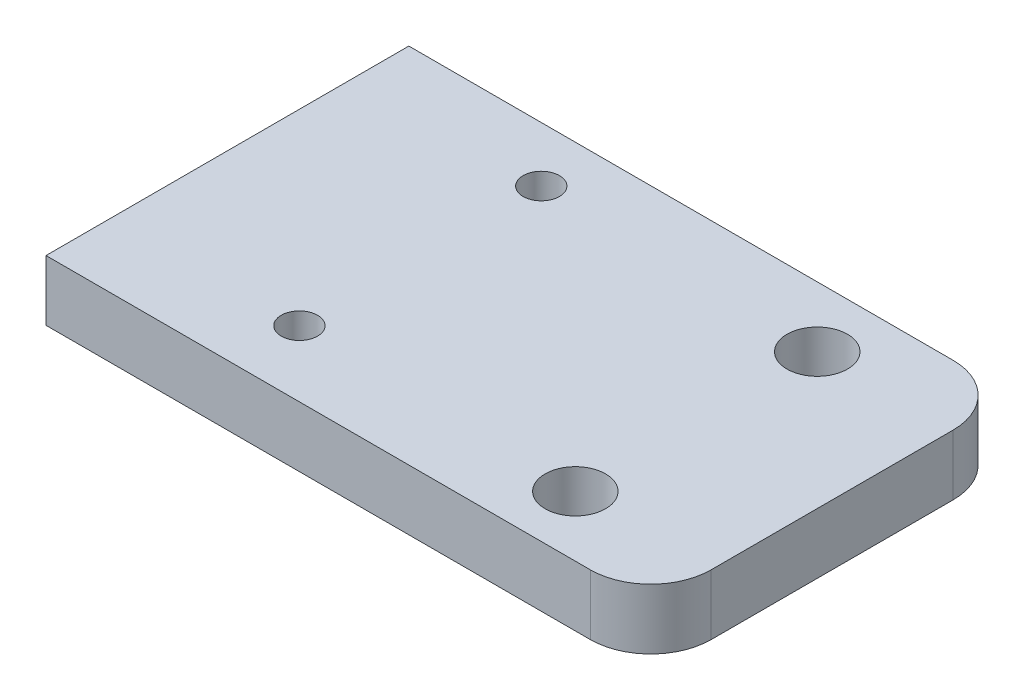
ISO-10303-21;
HEADER;
FILE_DESCRIPTION(('STEP AP214'),'2;1');
FILE_NAME('part.step','',(''),(''),'','','');
FILE_SCHEMA(('AUTOMOTIVE_DESIGN { 1 0 10303 214 1 1 1 1 }'));
ENDSEC;
DATA;
#1=APPLICATION_CONTEXT('core data for automotive mechanical design processes');
#2=APPLICATION_PROTOCOL_DEFINITION('international standard','automotive_design',2000,#1);
#3=PRODUCT_CONTEXT('',#1,'mechanical');
#4=PRODUCT('Part','Part','',(#3));
#5=PRODUCT_RELATED_PRODUCT_CATEGORY('part','',(#4));
#6=PRODUCT_DEFINITION_FORMATION('','',#4);
#7=PRODUCT_DEFINITION_CONTEXT('part definition',#1,'design');
#8=PRODUCT_DEFINITION('design','',#6,#7);
#9=PRODUCT_DEFINITION_SHAPE('','',#8);
#10=(LENGTH_UNIT() NAMED_UNIT(*) SI_UNIT(.MILLI.,.METRE.));
#11=(NAMED_UNIT(*) PLANE_ANGLE_UNIT() SI_UNIT($,.RADIAN.));
#12=(NAMED_UNIT(*) SI_UNIT($,.STERADIAN.) SOLID_ANGLE_UNIT());
#13=UNCERTAINTY_MEASURE_WITH_UNIT(LENGTH_MEASURE(1.E-05),#10,'distance_accuracy_value','');
#14=(GEOMETRIC_REPRESENTATION_CONTEXT(3) GLOBAL_UNCERTAINTY_ASSIGNED_CONTEXT((#13)) GLOBAL_UNIT_ASSIGNED_CONTEXT((#10,
#11,#12)) REPRESENTATION_CONTEXT('',''));
#15=CARTESIAN_POINT('',(0.,0.,0.));
#16=DIRECTION('',(0.,0.,1.));
#17=DIRECTION('',(1.,0.,0.));
#18=AXIS2_PLACEMENT_3D('',#15,#16,#17);
#19=CARTESIAN_POINT('',(0.,5.,0.));
#20=DIRECTION('',(0.,1.,0.));
#21=DIRECTION('',(0.,0.,1.));
#22=AXIS2_PLACEMENT_3D('',#19,#20,#21);
#23=PLANE('',#22);
#24=CARTESIAN_POINT('',(-11.2325769796568,5.,-4.99999999999999));
#25=DIRECTION('',(0.,1.,0.));
#26=DIRECTION('',(0.,0.,1.));
#27=AXIS2_PLACEMENT_3D('',#24,#25,#26);
#28=CIRCLE('',#27,2.5);
#29=CARTESIAN_POINT('',(-11.2325769796568,5.,-2.49999999999999));
#30=VERTEX_POINT('',#29);
#31=EDGE_CURVE('E185',#30,#30,#28,.T.);
#32=ORIENTED_EDGE('',*,*,#31,.F.);
#33=EDGE_LOOP('',(#32));
#34=FACE_BOUND('',#33,.T.);
#35=CARTESIAN_POINT('',(-11.2325769796568,5.,-25.));
#36=DIRECTION('',(0.,1.,0.));
#37=DIRECTION('',(0.,0.,1.));
#38=AXIS2_PLACEMENT_3D('',#35,#36,#37);
#39=CIRCLE('',#38,2.5);
#40=CARTESIAN_POINT('',(-11.2325769796568,5.,-22.5));
#41=VERTEX_POINT('',#40);
#42=EDGE_CURVE('E189',#41,#41,#39,.T.);
#43=ORIENTED_EDGE('',*,*,#42,.F.);
#44=EDGE_LOOP('',(#43));
#45=FACE_BOUND('',#44,.T.);
#46=CARTESIAN_POINT('',(-34.5,5.,-5.44999999999936));
#47=DIRECTION('',(0.,1.,0.));
#48=DIRECTION('',(0.,0.,1.));
#49=AXIS2_PLACEMENT_3D('',#46,#47,#48);
#50=CIRCLE('',#49,1.5);
#51=CARTESIAN_POINT('',(-34.5,5.,-3.94999999999936));
#52=VERTEX_POINT('',#51);
#53=EDGE_CURVE('E118',#52,#52,#50,.T.);
#54=ORIENTED_EDGE('',*,*,#53,.F.);
#55=EDGE_LOOP('',(#54));
#56=FACE_BOUND('',#55,.T.);
#57=DIRECTION('',(0.,0.,-1.));
#58=VECTOR('',#57,1.);
#59=CARTESIAN_POINT('',(0.,5.,0.));
#60=LINE('',#59,#58);
#61=CARTESIAN_POINT('',(0.,5.,-5.));
#62=VERTEX_POINT('',#61);
#63=CARTESIAN_POINT('',(0.,5.,-25.));
#64=VERTEX_POINT('',#63);
#65=EDGE_CURVE('E97',#62,#64,#60,.T.);
#66=ORIENTED_EDGE('',*,*,#65,.T.);
#67=CARTESIAN_POINT('',(-5.,5.,-25.));
#68=DIRECTION('',(0.,1.,0.));
#69=DIRECTION('',(0.,0.,1.));
#70=AXIS2_PLACEMENT_3D('',#67,#68,#69);
#71=CIRCLE('',#70,5.);
#72=CARTESIAN_POINT('',(-5.,5.,-30.));
#73=VERTEX_POINT('',#72);
#74=EDGE_CURVE('E41',#64,#73,#71,.T.);
#75=ORIENTED_EDGE('',*,*,#74,.T.);
#76=DIRECTION('',(-1.,0.,0.));
#77=VECTOR('',#76,1.);
#78=CARTESIAN_POINT('',(0.,5.,-30.));
#79=LINE('',#78,#77);
#80=CARTESIAN_POINT('',(-50.,5.,-30.));
#81=VERTEX_POINT('',#80);
#82=EDGE_CURVE('E87',#73,#81,#79,.T.);
#83=ORIENTED_EDGE('',*,*,#82,.T.);
#84=DIRECTION('',(0.,0.,1.));
#85=VECTOR('',#84,1.);
#86=CARTESIAN_POINT('',(-50.,5.,0.));
#87=LINE('',#86,#85);
#88=CARTESIAN_POINT('',(-50.,5.,0.));
#89=VERTEX_POINT('',#88);
#90=EDGE_CURVE('E91',#81,#89,#87,.T.);
#91=ORIENTED_EDGE('',*,*,#90,.T.);
#92=DIRECTION('',(1.,0.,0.));
#93=VECTOR('',#92,1.);
#94=CARTESIAN_POINT('',(0.,5.,0.));
#95=LINE('',#94,#93);
#96=CARTESIAN_POINT('',(-5.,5.,0.));
#97=VERTEX_POINT('',#96);
#98=EDGE_CURVE('E111',#89,#97,#95,.T.);
#99=ORIENTED_EDGE('',*,*,#98,.T.);
#100=CARTESIAN_POINT('',(-5.,5.,-5.));
#101=DIRECTION('',(0.,1.,0.));
#102=DIRECTION('',(0.,0.,1.));
#103=AXIS2_PLACEMENT_3D('',#100,#101,#102);
#104=CIRCLE('',#103,5.);
#105=EDGE_CURVE('E134',#97,#62,#104,.T.);
#106=ORIENTED_EDGE('',*,*,#105,.T.);
#107=EDGE_LOOP('',(#66,#75,#83,#91,#99,#106));
#108=FACE_BOUND('',#107,.T.);
#109=CARTESIAN_POINT('',(-34.5,5.,-25.4499999999994));
#110=DIRECTION('',(0.,1.,0.));
#111=DIRECTION('',(0.,0.,1.));
#112=AXIS2_PLACEMENT_3D('',#109,#110,#111);
#113=CIRCLE('',#112,1.5);
#114=CARTESIAN_POINT('',(-34.5,5.,-23.9499999999994));
#115=VERTEX_POINT('',#114);
#116=EDGE_CURVE('E199',#115,#115,#113,.T.);
#117=ORIENTED_EDGE('',*,*,#116,.F.);
#118=EDGE_LOOP('',(#117));
#119=FACE_BOUND('',#118,.T.);
#120=ADVANCED_FACE('F33',(#34,#45,#56,#108,#119),#23,.T.);
#121=CARTESIAN_POINT('',(0.,0.,0.));
#122=DIRECTION('',(0.,1.,0.));
#123=DIRECTION('',(0.,0.,1.));
#124=AXIS2_PLACEMENT_3D('',#121,#122,#123);
#125=PLANE('',#124);
#126=CARTESIAN_POINT('',(-11.2325769796568,0.,-4.99999999999999));
#127=DIRECTION('',(0.,-1.,0.));
#128=DIRECTION('',(0.,0.,-1.));
#129=AXIS2_PLACEMENT_3D('',#126,#127,#128);
#130=CIRCLE('',#129,2.5);
#131=CARTESIAN_POINT('',(-11.2325769796568,0.,-7.49999999999999));
#132=VERTEX_POINT('',#131);
#133=EDGE_CURVE('E188',#132,#132,#130,.T.);
#134=ORIENTED_EDGE('',*,*,#133,.F.);
#135=EDGE_LOOP('',(#134));
#136=FACE_BOUND('',#135,.T.);
#137=CARTESIAN_POINT('',(-11.2325769796568,0.,-25.));
#138=DIRECTION('',(0.,-1.,0.));
#139=DIRECTION('',(0.,0.,-1.));
#140=AXIS2_PLACEMENT_3D('',#137,#138,#139);
#141=CIRCLE('',#140,2.5);
#142=CARTESIAN_POINT('',(-11.2325769796568,0.,-27.5));
#143=VERTEX_POINT('',#142);
#144=EDGE_CURVE('E190',#143,#143,#141,.T.);
#145=ORIENTED_EDGE('',*,*,#144,.F.);
#146=EDGE_LOOP('',(#145));
#147=FACE_BOUND('',#146,.T.);
#148=DIRECTION('',(-1.,0.,0.));
#149=VECTOR('',#148,1.);
#150=CARTESIAN_POINT('',(0.,0.,-30.));
#151=LINE('',#150,#149);
#152=CARTESIAN_POINT('',(-5.,0.,-30.));
#153=VERTEX_POINT('',#152);
#154=CARTESIAN_POINT('',(-50.,0.,-30.));
#155=VERTEX_POINT('',#154);
#156=EDGE_CURVE('E103',#153,#155,#151,.T.);
#157=ORIENTED_EDGE('',*,*,#156,.F.);
#158=CARTESIAN_POINT('',(-5.,0.,-25.));
#159=DIRECTION('',(0.,1.,0.));
#160=DIRECTION('',(0.,0.,1.));
#161=AXIS2_PLACEMENT_3D('',#158,#159,#160);
#162=CIRCLE('',#161,5.);
#163=CARTESIAN_POINT('',(0.,0.,-25.));
#164=VERTEX_POINT('',#163);
#165=EDGE_CURVE('E128',#153,#164,#162,.F.);
#166=ORIENTED_EDGE('',*,*,#165,.T.);
#167=DIRECTION('',(0.,0.,-1.));
#168=VECTOR('',#167,1.);
#169=CARTESIAN_POINT('',(0.,0.,0.));
#170=LINE('',#169,#168);
#171=CARTESIAN_POINT('',(0.,0.,-5.));
#172=VERTEX_POINT('',#171);
#173=EDGE_CURVE('E116',#172,#164,#170,.T.);
#174=ORIENTED_EDGE('',*,*,#173,.F.);
#175=CARTESIAN_POINT('',(-5.,0.,-5.));
#176=DIRECTION('',(0.,1.,0.));
#177=DIRECTION('',(0.,0.,1.));
#178=AXIS2_PLACEMENT_3D('',#175,#176,#177);
#179=CIRCLE('',#178,5.);
#180=CARTESIAN_POINT('',(-5.,0.,0.));
#181=VERTEX_POINT('',#180);
#182=EDGE_CURVE('E126',#172,#181,#179,.F.);
#183=ORIENTED_EDGE('',*,*,#182,.T.);
#184=DIRECTION('',(1.,0.,0.));
#185=VECTOR('',#184,1.);
#186=CARTESIAN_POINT('',(0.,0.,0.));
#187=LINE('',#186,#185);
#188=CARTESIAN_POINT('',(-50.,0.,0.));
#189=VERTEX_POINT('',#188);
#190=EDGE_CURVE('E122',#189,#181,#187,.T.);
#191=ORIENTED_EDGE('',*,*,#190,.F.);
#192=DIRECTION('',(0.,0.,1.));
#193=VECTOR('',#192,1.);
#194=CARTESIAN_POINT('',(-50.,0.,0.));
#195=LINE('',#194,#193);
#196=EDGE_CURVE('E120',#155,#189,#195,.T.);
#197=ORIENTED_EDGE('',*,*,#196,.F.);
#198=EDGE_LOOP('',(#157,#166,#174,#183,#191,#197));
#199=FACE_BOUND('',#198,.T.);
#200=CARTESIAN_POINT('',(-34.5,0.,-5.44999999999936));
#201=DIRECTION('',(0.,1.,0.));
#202=DIRECTION('',(0.,0.,1.));
#203=AXIS2_PLACEMENT_3D('',#200,#201,#202);
#204=CIRCLE('',#203,1.5);
#205=CARTESIAN_POINT('',(-34.5,0.,-3.94999999999936));
#206=VERTEX_POINT('',#205);
#207=EDGE_CURVE('E202',#206,#206,#204,.T.);
#208=ORIENTED_EDGE('',*,*,#207,.T.);
#209=EDGE_LOOP('',(#208));
#210=FACE_BOUND('',#209,.T.);
#211=CARTESIAN_POINT('',(-34.5,0.,-25.4499999999994));
#212=DIRECTION('',(0.,1.,0.));
#213=DIRECTION('',(0.,0.,1.));
#214=AXIS2_PLACEMENT_3D('',#211,#212,#213);
#215=CIRCLE('',#214,1.5);
#216=CARTESIAN_POINT('',(-34.5,0.,-23.9499999999994));
#217=VERTEX_POINT('',#216);
#218=EDGE_CURVE('E198',#217,#217,#215,.T.);
#219=ORIENTED_EDGE('',*,*,#218,.T.);
#220=EDGE_LOOP('',(#219));
#221=FACE_BOUND('',#220,.T.);
#222=ADVANCED_FACE('F142',(#136,#147,#199,#210,#221),#125,.F.);
#223=CARTESIAN_POINT('',(0.,5.,0.));
#224=DIRECTION('',(-1.,0.,0.));
#225=DIRECTION('',(0.,0.,1.));
#226=AXIS2_PLACEMENT_3D('',#223,#224,#225);
#227=PLANE('',#226);
#228=ORIENTED_EDGE('',*,*,#173,.T.);
#229=DIRECTION('',(0.,-1.,0.));
#230=VECTOR('',#229,1.);
#231=CARTESIAN_POINT('',(0.,5.,-25.));
#232=LINE('',#231,#230);
#233=EDGE_CURVE('E54',#164,#64,#232,.F.);
#234=ORIENTED_EDGE('',*,*,#233,.T.);
#235=ORIENTED_EDGE('',*,*,#65,.F.);
#236=DIRECTION('',(0.,-1.,0.));
#237=VECTOR('',#236,1.);
#238=CARTESIAN_POINT('',(0.,5.,-5.));
#239=LINE('',#238,#237);
#240=EDGE_CURVE('E130',#62,#172,#239,.T.);
#241=ORIENTED_EDGE('',*,*,#240,.T.);
#242=EDGE_LOOP('',(#228,#234,#235,#241));
#243=FACE_BOUND('',#242,.T.);
#244=ADVANCED_FACE('F138',(#243),#227,.F.);
#245=CARTESIAN_POINT('',(0.,5.,-30.));
#246=DIRECTION('',(0.,0.,1.));
#247=DIRECTION('',(1.,0.,0.));
#248=AXIS2_PLACEMENT_3D('',#245,#246,#247);
#249=PLANE('',#248);
#250=ORIENTED_EDGE('',*,*,#82,.F.);
#251=DIRECTION('',(0.,-1.,0.));
#252=VECTOR('',#251,1.);
#253=CARTESIAN_POINT('',(-5.,5.,-30.));
#254=LINE('',#253,#252);
#255=EDGE_CURVE('E106',#73,#153,#254,.T.);
#256=ORIENTED_EDGE('',*,*,#255,.T.);
#257=ORIENTED_EDGE('',*,*,#156,.T.);
#258=DIRECTION('',(0.,-1.,0.));
#259=VECTOR('',#258,1.);
#260=CARTESIAN_POINT('',(-50.,5.,-30.));
#261=LINE('',#260,#259);
#262=EDGE_CURVE('E100',#81,#155,#261,.T.);
#263=ORIENTED_EDGE('',*,*,#262,.F.);
#264=EDGE_LOOP('',(#250,#256,#257,#263));
#265=FACE_BOUND('',#264,.T.);
#266=ADVANCED_FACE('F101',(#265),#249,.F.);
#267=CARTESIAN_POINT('',(-50.,5.,0.));
#268=DIRECTION('',(1.,0.,0.));
#269=DIRECTION('',(0.,0.,-1.));
#270=AXIS2_PLACEMENT_3D('',#267,#268,#269);
#271=PLANE('',#270);
#272=ORIENTED_EDGE('',*,*,#196,.T.);
#273=DIRECTION('',(0.,-1.,0.));
#274=VECTOR('',#273,1.);
#275=CARTESIAN_POINT('',(-50.,5.,0.));
#276=LINE('',#275,#274);
#277=EDGE_CURVE('E107',#89,#189,#276,.T.);
#278=ORIENTED_EDGE('',*,*,#277,.F.);
#279=ORIENTED_EDGE('',*,*,#90,.F.);
#280=ORIENTED_EDGE('',*,*,#262,.T.);
#281=EDGE_LOOP('',(#272,#278,#279,#280));
#282=FACE_BOUND('',#281,.T.);
#283=ADVANCED_FACE('F109',(#282),#271,.F.);
#284=CARTESIAN_POINT('',(0.,5.,0.));
#285=DIRECTION('',(0.,0.,-1.));
#286=DIRECTION('',(-1.,0.,0.));
#287=AXIS2_PLACEMENT_3D('',#284,#285,#286);
#288=PLANE('',#287);
#289=ORIENTED_EDGE('',*,*,#190,.T.);
#290=DIRECTION('',(0.,-1.,0.));
#291=VECTOR('',#290,1.);
#292=CARTESIAN_POINT('',(-5.,5.,0.));
#293=LINE('',#292,#291);
#294=EDGE_CURVE('E11',#181,#97,#293,.F.);
#295=ORIENTED_EDGE('',*,*,#294,.T.);
#296=ORIENTED_EDGE('',*,*,#98,.F.);
#297=ORIENTED_EDGE('',*,*,#277,.T.);
#298=EDGE_LOOP('',(#289,#295,#296,#297));
#299=FACE_BOUND('',#298,.T.);
#300=ADVANCED_FACE('F144',(#299),#288,.F.);
#301=CARTESIAN_POINT('',(-34.5,5.,-5.44999999999936));
#302=DIRECTION('',(0.,-1.,0.));
#303=DIRECTION('',(0.,0.,-1.));
#304=AXIS2_PLACEMENT_3D('',#301,#302,#303);
#305=CYLINDRICAL_SURFACE('',#304,1.5);
#306=ORIENTED_EDGE('',*,*,#53,.T.);
#307=EDGE_LOOP('',(#306));
#308=FACE_BOUND('',#307,.T.);
#309=ORIENTED_EDGE('',*,*,#207,.F.);
#310=EDGE_LOOP('',(#309));
#311=FACE_BOUND('',#310,.T.);
#312=ADVANCED_FACE('F146',(#308,#311),#305,.F.);
#313=CARTESIAN_POINT('',(-34.5,5.,-25.4499999999994));
#314=DIRECTION('',(0.,-1.,0.));
#315=DIRECTION('',(0.,0.,-1.));
#316=AXIS2_PLACEMENT_3D('',#313,#314,#315);
#317=CYLINDRICAL_SURFACE('',#316,1.5);
#318=ORIENTED_EDGE('',*,*,#116,.T.);
#319=EDGE_LOOP('',(#318));
#320=FACE_BOUND('',#319,.T.);
#321=ORIENTED_EDGE('',*,*,#218,.F.);
#322=EDGE_LOOP('',(#321));
#323=FACE_BOUND('',#322,.T.);
#324=ADVANCED_FACE('F153',(#320,#323),#317,.F.);
#325=CARTESIAN_POINT('',(-5.,5.,-25.));
#326=DIRECTION('',(0.,-1.,0.));
#327=DIRECTION('',(0.,0.,-1.));
#328=AXIS2_PLACEMENT_3D('',#325,#326,#327);
#329=CYLINDRICAL_SURFACE('',#328,5.);
#330=ORIENTED_EDGE('',*,*,#74,.F.);
#331=ORIENTED_EDGE('',*,*,#233,.F.);
#332=ORIENTED_EDGE('',*,*,#165,.F.);
#333=ORIENTED_EDGE('',*,*,#255,.F.);
#334=EDGE_LOOP('',(#330,#331,#332,#333));
#335=FACE_BOUND('',#334,.T.);
#336=ADVANCED_FACE('F172',(#335),#329,.T.);
#337=CARTESIAN_POINT('',(-5.,5.,-5.));
#338=DIRECTION('',(0.,-1.,0.));
#339=DIRECTION('',(0.,0.,-1.));
#340=AXIS2_PLACEMENT_3D('',#337,#338,#339);
#341=CYLINDRICAL_SURFACE('',#340,5.);
#342=ORIENTED_EDGE('',*,*,#105,.F.);
#343=ORIENTED_EDGE('',*,*,#294,.F.);
#344=ORIENTED_EDGE('',*,*,#182,.F.);
#345=ORIENTED_EDGE('',*,*,#240,.F.);
#346=EDGE_LOOP('',(#342,#343,#344,#345));
#347=FACE_BOUND('',#346,.T.);
#348=ADVANCED_FACE('F35',(#347),#341,.T.);
#349=CARTESIAN_POINT('',(-11.2325769796568,9.00000000000001,-25.));
#350=DIRECTION('',(0.,-1.,0.));
#351=DIRECTION('',(0.,0.,-1.));
#352=AXIS2_PLACEMENT_3D('',#349,#350,#351);
#353=CYLINDRICAL_SURFACE('',#352,2.5);
#354=ORIENTED_EDGE('',*,*,#42,.T.);
#355=EDGE_LOOP('',(#354));
#356=FACE_BOUND('',#355,.T.);
#357=ORIENTED_EDGE('',*,*,#144,.T.);
#358=EDGE_LOOP('',(#357));
#359=FACE_BOUND('',#358,.T.);
#360=ADVANCED_FACE('F174',(#356,#359),#353,.F.);
#361=CARTESIAN_POINT('',(-11.2325769796568,9.00000000000001,-4.99999999999999));
#362=DIRECTION('',(0.,-1.,0.));
#363=DIRECTION('',(0.,0.,-1.));
#364=AXIS2_PLACEMENT_3D('',#361,#362,#363);
#365=CYLINDRICAL_SURFACE('',#364,2.5);
#366=ORIENTED_EDGE('',*,*,#31,.T.);
#367=EDGE_LOOP('',(#366));
#368=FACE_BOUND('',#367,.T.);
#369=ORIENTED_EDGE('',*,*,#133,.T.);
#370=EDGE_LOOP('',(#369));
#371=FACE_BOUND('',#370,.T.);
#372=ADVANCED_FACE('F177',(#368,#371),#365,.F.);
#373=CLOSED_SHELL('',(#120,#222,#244,#266,#283,#300,#312,#324,#336,#348,#360,#372));
#374=MANIFOLD_SOLID_BREP('B2',#373);
#375=ADVANCED_BREP_SHAPE_REPRESENTATION('',(#18,#374),#14);
#376=SHAPE_DEFINITION_REPRESENTATION(#9,#375);
ENDSEC;
END-ISO-10303-21;
